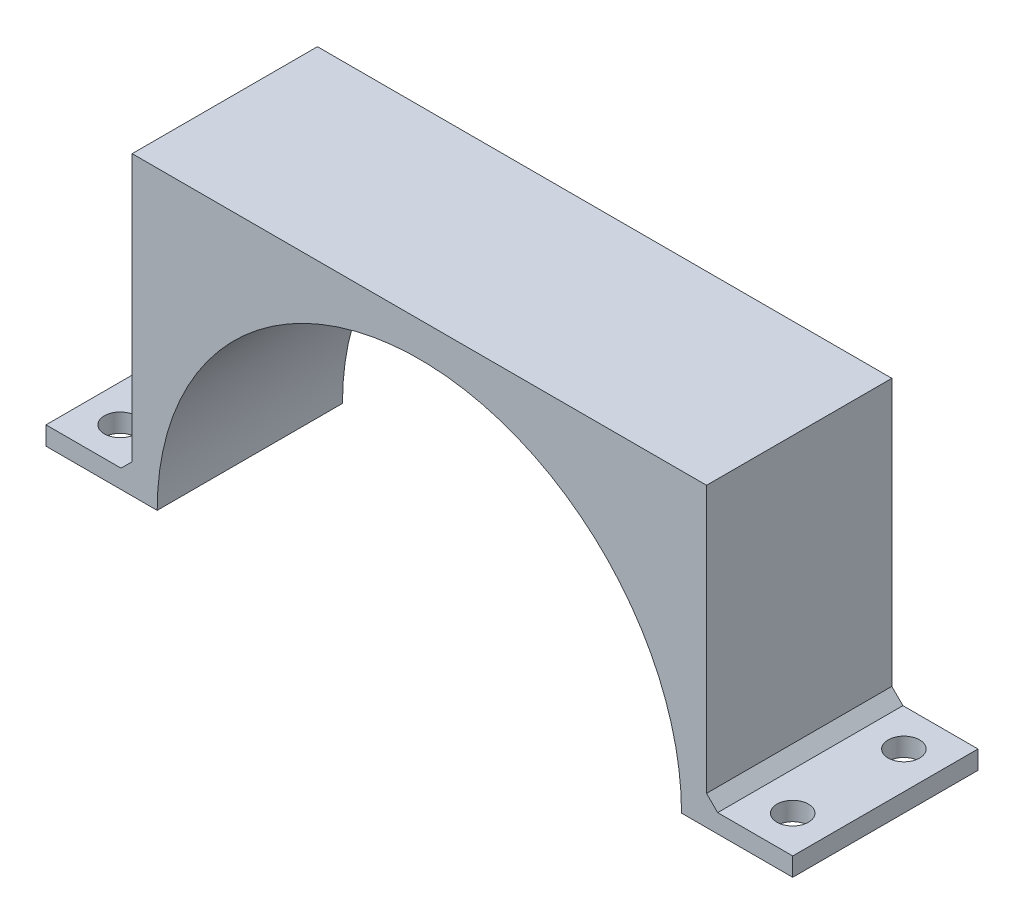
ISO-10303-21;
HEADER;
FILE_DESCRIPTION(('STEP AP214'),'2;1');
FILE_NAME('part.step','',(''),(''),'','','');
FILE_SCHEMA(('AUTOMOTIVE_DESIGN { 1 0 10303 214 1 1 1 1 }'));
ENDSEC;
DATA;
#1=APPLICATION_CONTEXT('core data for automotive mechanical design processes');
#2=APPLICATION_PROTOCOL_DEFINITION('international standard','automotive_design',2000,#1);
#3=PRODUCT_CONTEXT('',#1,'mechanical');
#4=PRODUCT('Part','Part','',(#3));
#5=PRODUCT_RELATED_PRODUCT_CATEGORY('part','',(#4));
#6=PRODUCT_DEFINITION_FORMATION('','',#4);
#7=PRODUCT_DEFINITION_CONTEXT('part definition',#1,'design');
#8=PRODUCT_DEFINITION('design','',#6,#7);
#9=PRODUCT_DEFINITION_SHAPE('','',#8);
#10=(LENGTH_UNIT() NAMED_UNIT(*) SI_UNIT(.MILLI.,.METRE.));
#11=(NAMED_UNIT(*) PLANE_ANGLE_UNIT() SI_UNIT($,.RADIAN.));
#12=(NAMED_UNIT(*) SI_UNIT($,.STERADIAN.) SOLID_ANGLE_UNIT());
#13=UNCERTAINTY_MEASURE_WITH_UNIT(LENGTH_MEASURE(1.E-05),#10,'distance_accuracy_value','');
#14=(GEOMETRIC_REPRESENTATION_CONTEXT(3) GLOBAL_UNCERTAINTY_ASSIGNED_CONTEXT((#13)) GLOBAL_UNIT_ASSIGNED_CONTEXT((#10,
#11,#12)) REPRESENTATION_CONTEXT('',''));
#15=CARTESIAN_POINT('',(0.,0.,0.));
#16=DIRECTION('',(0.,0.,1.));
#17=DIRECTION('',(1.,0.,0.));
#18=AXIS2_PLACEMENT_3D('',#15,#16,#17);
#19=CARTESIAN_POINT('',(-77.5,8.00000000000001,50.));
#20=DIRECTION('',(-0.707106781186548,0.707106781186547,0.));
#21=DIRECTION('',(0.,0.,-1.));
#22=AXIS2_PLACEMENT_3D('',#19,#20,#21);
#23=PLANE('',#22);
#24=DIRECTION('',(0.,0.,1.));
#25=VECTOR('',#24,1.);
#26=CARTESIAN_POINT('',(-77.5,8.00000000000001,0.));
#27=LINE('',#26,#25);
#28=CARTESIAN_POINT('',(-77.5,8.00000000000001,0.));
#29=VERTEX_POINT('',#28);
#30=CARTESIAN_POINT('',(-77.5,8.00000000000001,50.));
#31=VERTEX_POINT('',#30);
#32=EDGE_CURVE('E193',#29,#31,#27,.T.);
#33=ORIENTED_EDGE('',*,*,#32,.F.);
#34=DIRECTION('',(-0.707106781186547,-0.707106781186548,0.));
#35=VECTOR('',#34,1.);
#36=CARTESIAN_POINT('',(-77.5,8.00000000000001,0.));
#37=LINE('',#36,#35);
#38=CARTESIAN_POINT('',(-80.5,5.,0.));
#39=VERTEX_POINT('',#38);
#40=EDGE_CURVE('E58',#29,#39,#37,.T.);
#41=ORIENTED_EDGE('',*,*,#40,.T.);
#42=DIRECTION('',(0.,0.,-1.));
#43=VECTOR('',#42,1.);
#44=CARTESIAN_POINT('',(-80.5,5.,0.));
#45=LINE('',#44,#43);
#46=CARTESIAN_POINT('',(-80.5,5.,50.));
#47=VERTEX_POINT('',#46);
#48=EDGE_CURVE('E197',#47,#39,#45,.T.);
#49=ORIENTED_EDGE('',*,*,#48,.F.);
#50=DIRECTION('',(0.707106781186547,0.707106781186548,0.));
#51=VECTOR('',#50,1.);
#52=CARTESIAN_POINT('',(-42.75,42.75,50.));
#53=LINE('',#52,#51);
#54=EDGE_CURVE('E13',#47,#31,#53,.T.);
#55=ORIENTED_EDGE('',*,*,#54,.T.);
#56=EDGE_LOOP('',(#33,#41,#49,#55));
#57=FACE_BOUND('',#56,.T.);
#58=ADVANCED_FACE('F49',(#57),#23,.T.);
#59=CARTESIAN_POINT('',(77.5,8.,50.));
#60=DIRECTION('',(0.707106781186547,0.707106781186548,0.));
#61=DIRECTION('',(0.,0.,1.));
#62=AXIS2_PLACEMENT_3D('',#59,#60,#61);
#63=PLANE('',#62);
#64=DIRECTION('',(0.,0.,-1.));
#65=VECTOR('',#64,1.);
#66=CARTESIAN_POINT('',(77.5,8.,50.));
#67=LINE('',#66,#65);
#68=CARTESIAN_POINT('',(77.5,8.,50.));
#69=VERTEX_POINT('',#68);
#70=CARTESIAN_POINT('',(77.5,8.,0.));
#71=VERTEX_POINT('',#70);
#72=EDGE_CURVE('E163',#69,#71,#67,.T.);
#73=ORIENTED_EDGE('',*,*,#72,.F.);
#74=DIRECTION('',(0.707106781186548,-0.707106781186547,0.));
#75=VECTOR('',#74,1.);
#76=CARTESIAN_POINT('',(42.75,42.75,50.));
#77=LINE('',#76,#75);
#78=CARTESIAN_POINT('',(80.5,5.,50.));
#79=VERTEX_POINT('',#78);
#80=EDGE_CURVE('E187',#69,#79,#77,.T.);
#81=ORIENTED_EDGE('',*,*,#80,.T.);
#82=DIRECTION('',(0.,0.,1.));
#83=VECTOR('',#82,1.);
#84=CARTESIAN_POINT('',(80.5,5.,50.));
#85=LINE('',#84,#83);
#86=CARTESIAN_POINT('',(80.5,5.,0.));
#87=VERTEX_POINT('',#86);
#88=EDGE_CURVE('E168',#87,#79,#85,.T.);
#89=ORIENTED_EDGE('',*,*,#88,.F.);
#90=DIRECTION('',(-0.707106781186548,0.707106781186547,0.));
#91=VECTOR('',#90,1.);
#92=CARTESIAN_POINT('',(77.5,8.,0.));
#93=LINE('',#92,#91);
#94=EDGE_CURVE('E190',#87,#71,#93,.T.);
#95=ORIENTED_EDGE('',*,*,#94,.T.);
#96=EDGE_LOOP('',(#73,#81,#89,#95));
#97=FACE_BOUND('',#96,.T.);
#98=ADVANCED_FACE('F300',(#97),#63,.T.);
#99=CARTESIAN_POINT('',(0.,0.,50.));
#100=DIRECTION('',(0.,0.,-1.));
#101=DIRECTION('',(-1.,0.,0.));
#102=AXIS2_PLACEMENT_3D('',#99,#100,#101);
#103=CYLINDRICAL_SURFACE('',#102,70.75);
#104=CARTESIAN_POINT('',(0.,0.,0.));
#105=DIRECTION('',(0.,0.,-1.));
#106=DIRECTION('',(-1.,0.,0.));
#107=AXIS2_PLACEMENT_3D('',#104,#105,#106);
#108=CIRCLE('',#107,70.75);
#109=CARTESIAN_POINT('',(-70.75,0.,0.));
#110=VERTEX_POINT('',#109);
#111=CARTESIAN_POINT('',(70.75,0.,0.));
#112=VERTEX_POINT('',#111);
#113=EDGE_CURVE('E161',#110,#112,#108,.T.);
#114=ORIENTED_EDGE('',*,*,#113,.T.);
#115=DIRECTION('',(0.,0.,-1.));
#116=VECTOR('',#115,1.);
#117=CARTESIAN_POINT('',(70.75,0.,50.));
#118=LINE('',#117,#116);
#119=CARTESIAN_POINT('',(70.75,0.,50.));
#120=VERTEX_POINT('',#119);
#121=EDGE_CURVE('E140',#120,#112,#118,.T.);
#122=ORIENTED_EDGE('',*,*,#121,.F.);
#123=CARTESIAN_POINT('',(0.,0.,50.));
#124=DIRECTION('',(0.,0.,-1.));
#125=DIRECTION('',(-1.,0.,0.));
#126=AXIS2_PLACEMENT_3D('',#123,#124,#125);
#127=CIRCLE('',#126,70.75);
#128=CARTESIAN_POINT('',(-70.75,0.,50.));
#129=VERTEX_POINT('',#128);
#130=EDGE_CURVE('E147',#129,#120,#127,.T.);
#131=ORIENTED_EDGE('',*,*,#130,.F.);
#132=DIRECTION('',(0.,0.,-1.));
#133=VECTOR('',#132,1.);
#134=CARTESIAN_POINT('',(-70.75,0.,50.));
#135=LINE('',#134,#133);
#136=EDGE_CURVE('E219',#129,#110,#135,.T.);
#137=ORIENTED_EDGE('',*,*,#136,.T.);
#138=EDGE_LOOP('',(#114,#122,#131,#137));
#139=FACE_BOUND('',#138,.T.);
#140=ADVANCED_FACE('F159',(#139),#103,.F.);
#141=CARTESIAN_POINT('',(70.75,0.,50.));
#142=DIRECTION('',(0.,1.,0.));
#143=DIRECTION('',(0.,0.,1.));
#144=AXIS2_PLACEMENT_3D('',#141,#142,#143);
#145=PLANE('',#144);
#146=CARTESIAN_POINT('',(90.75,0.,10.));
#147=DIRECTION('',(0.,1.,0.));
#148=DIRECTION('',(0.,0.,1.));
#149=AXIS2_PLACEMENT_3D('',#146,#147,#148);
#150=CIRCLE('',#149,4.25000000000001);
#151=CARTESIAN_POINT('',(90.75,0.,14.25));
#152=VERTEX_POINT('',#151);
#153=EDGE_CURVE('E208',#152,#152,#150,.F.);
#154=ORIENTED_EDGE('',*,*,#153,.F.);
#155=EDGE_LOOP('',(#154));
#156=FACE_BOUND('',#155,.T.);
#157=CARTESIAN_POINT('',(90.75,0.,40.));
#158=DIRECTION('',(0.,1.,0.));
#159=DIRECTION('',(0.,0.,1.));
#160=AXIS2_PLACEMENT_3D('',#157,#158,#159);
#161=CIRCLE('',#160,4.25000000000001);
#162=CARTESIAN_POINT('',(90.75,0.,44.25));
#163=VERTEX_POINT('',#162);
#164=EDGE_CURVE('E204',#163,#163,#161,.F.);
#165=ORIENTED_EDGE('',*,*,#164,.F.);
#166=EDGE_LOOP('',(#165));
#167=FACE_BOUND('',#166,.T.);
#168=DIRECTION('',(1.,0.,0.));
#169=VECTOR('',#168,1.);
#170=CARTESIAN_POINT('',(70.75,0.,0.));
#171=LINE('',#170,#169);
#172=CARTESIAN_POINT('',(100.75,0.,0.));
#173=VERTEX_POINT('',#172);
#174=EDGE_CURVE('E261',#112,#173,#171,.T.);
#175=ORIENTED_EDGE('',*,*,#174,.T.);
#176=DIRECTION('',(0.,0.,-1.));
#177=VECTOR('',#176,1.);
#178=CARTESIAN_POINT('',(100.75,0.,50.));
#179=LINE('',#178,#177);
#180=CARTESIAN_POINT('',(100.75,0.,50.));
#181=VERTEX_POINT('',#180);
#182=EDGE_CURVE('E143',#181,#173,#179,.T.);
#183=ORIENTED_EDGE('',*,*,#182,.F.);
#184=DIRECTION('',(1.,0.,0.));
#185=VECTOR('',#184,1.);
#186=CARTESIAN_POINT('',(70.75,0.,50.));
#187=LINE('',#186,#185);
#188=EDGE_CURVE('E136',#120,#181,#187,.T.);
#189=ORIENTED_EDGE('',*,*,#188,.F.);
#190=ORIENTED_EDGE('',*,*,#121,.T.);
#191=EDGE_LOOP('',(#175,#183,#189,#190));
#192=FACE_BOUND('',#191,.T.);
#193=ADVANCED_FACE('F138',(#156,#167,#192),#145,.F.);
#194=CARTESIAN_POINT('',(100.75,0.,50.));
#195=DIRECTION('',(-1.,0.,0.));
#196=DIRECTION('',(0.,-1.,0.));
#197=AXIS2_PLACEMENT_3D('',#194,#195,#196);
#198=PLANE('',#197);
#199=DIRECTION('',(0.,1.,0.));
#200=VECTOR('',#199,1.);
#201=CARTESIAN_POINT('',(100.75,0.,0.));
#202=LINE('',#201,#200);
#203=CARTESIAN_POINT('',(100.75,5.,0.));
#204=VERTEX_POINT('',#203);
#205=EDGE_CURVE('E264',#173,#204,#202,.T.);
#206=ORIENTED_EDGE('',*,*,#205,.T.);
#207=DIRECTION('',(0.,0.,-1.));
#208=VECTOR('',#207,1.);
#209=CARTESIAN_POINT('',(100.75,5.,50.));
#210=LINE('',#209,#208);
#211=CARTESIAN_POINT('',(100.75,5.,50.));
#212=VERTEX_POINT('',#211);
#213=EDGE_CURVE('E171',#212,#204,#210,.T.);
#214=ORIENTED_EDGE('',*,*,#213,.F.);
#215=DIRECTION('',(0.,1.,0.));
#216=VECTOR('',#215,1.);
#217=CARTESIAN_POINT('',(100.75,0.,50.));
#218=LINE('',#217,#216);
#219=EDGE_CURVE('E146',#181,#212,#218,.T.);
#220=ORIENTED_EDGE('',*,*,#219,.F.);
#221=ORIENTED_EDGE('',*,*,#182,.T.);
#222=EDGE_LOOP('',(#206,#214,#220,#221));
#223=FACE_BOUND('',#222,.T.);
#224=ADVANCED_FACE('F321',(#223),#198,.F.);
#225=CARTESIAN_POINT('',(100.75,5.,50.));
#226=DIRECTION('',(0.,-1.,0.));
#227=DIRECTION('',(1.,0.,0.));
#228=AXIS2_PLACEMENT_3D('',#225,#226,#227);
#229=PLANE('',#228);
#230=CARTESIAN_POINT('',(90.75,5.00000000000001,10.));
#231=DIRECTION('',(0.,-1.,0.));
#232=DIRECTION('',(1.,0.,0.));
#233=AXIS2_PLACEMENT_3D('',#230,#231,#232);
#234=CIRCLE('',#233,4.25000000000001);
#235=CARTESIAN_POINT('',(95.,5.,10.));
#236=VERTEX_POINT('',#235);
#237=EDGE_CURVE('E201',#236,#236,#234,.T.);
#238=ORIENTED_EDGE('',*,*,#237,.T.);
#239=EDGE_LOOP('',(#238));
#240=FACE_BOUND('',#239,.T.);
#241=CARTESIAN_POINT('',(90.75,5.00000000000001,40.));
#242=DIRECTION('',(0.,-1.,0.));
#243=DIRECTION('',(1.,0.,0.));
#244=AXIS2_PLACEMENT_3D('',#241,#242,#243);
#245=CIRCLE('',#244,4.25000000000001);
#246=CARTESIAN_POINT('',(95.,5.,40.));
#247=VERTEX_POINT('',#246);
#248=EDGE_CURVE('E205',#247,#247,#245,.T.);
#249=ORIENTED_EDGE('',*,*,#248,.T.);
#250=EDGE_LOOP('',(#249));
#251=FACE_BOUND('',#250,.T.);
#252=DIRECTION('',(-1.,0.,0.));
#253=VECTOR('',#252,1.);
#254=CARTESIAN_POINT('',(100.75,5.,0.));
#255=LINE('',#254,#253);
#256=EDGE_CURVE('E269',#204,#87,#255,.T.);
#257=ORIENTED_EDGE('',*,*,#256,.T.);
#258=ORIENTED_EDGE('',*,*,#88,.T.);
#259=DIRECTION('',(-1.,0.,0.));
#260=VECTOR('',#259,1.);
#261=CARTESIAN_POINT('',(100.75,5.,50.));
#262=LINE('',#261,#260);
#263=EDGE_CURVE('E237',#212,#79,#262,.T.);
#264=ORIENTED_EDGE('',*,*,#263,.F.);
#265=ORIENTED_EDGE('',*,*,#213,.T.);
#266=EDGE_LOOP('',(#257,#258,#264,#265));
#267=FACE_BOUND('',#266,.T.);
#268=ADVANCED_FACE('F289',(#240,#251,#267),#229,.F.);
#269=CARTESIAN_POINT('',(77.5,5.,50.));
#270=DIRECTION('',(-1.,0.,0.));
#271=DIRECTION('',(0.,0.,1.));
#272=AXIS2_PLACEMENT_3D('',#269,#270,#271);
#273=PLANE('',#272);
#274=DIRECTION('',(0.,1.,0.));
#275=VECTOR('',#274,1.);
#276=CARTESIAN_POINT('',(77.5,5.,50.));
#277=LINE('',#276,#275);
#278=CARTESIAN_POINT('',(77.5,80.,50.));
#279=VERTEX_POINT('',#278);
#280=EDGE_CURVE('E235',#69,#279,#277,.T.);
#281=ORIENTED_EDGE('',*,*,#280,.F.);
#282=ORIENTED_EDGE('',*,*,#72,.T.);
#283=DIRECTION('',(0.,1.,0.));
#284=VECTOR('',#283,1.);
#285=CARTESIAN_POINT('',(77.5,5.,0.));
#286=LINE('',#285,#284);
#287=CARTESIAN_POINT('',(77.5,80.,0.));
#288=VERTEX_POINT('',#287);
#289=EDGE_CURVE('E273',#71,#288,#286,.T.);
#290=ORIENTED_EDGE('',*,*,#289,.T.);
#291=DIRECTION('',(0.,0.,-1.));
#292=VECTOR('',#291,1.);
#293=CARTESIAN_POINT('',(77.5,80.,50.));
#294=LINE('',#293,#292);
#295=EDGE_CURVE('E233',#279,#288,#294,.T.);
#296=ORIENTED_EDGE('',*,*,#295,.F.);
#297=EDGE_LOOP('',(#281,#282,#290,#296));
#298=FACE_BOUND('',#297,.T.);
#299=ADVANCED_FACE('F328',(#298),#273,.F.);
#300=CARTESIAN_POINT('',(77.5,80.,50.));
#301=DIRECTION('',(0.,-1.,0.));
#302=DIRECTION('',(0.,0.,-1.));
#303=AXIS2_PLACEMENT_3D('',#300,#301,#302);
#304=PLANE('',#303);
#305=DIRECTION('',(-1.,0.,0.));
#306=VECTOR('',#305,1.);
#307=CARTESIAN_POINT('',(77.5,80.,0.));
#308=LINE('',#307,#306);
#309=CARTESIAN_POINT('',(-77.5,80.,0.));
#310=VERTEX_POINT('',#309);
#311=EDGE_CURVE('E227',#288,#310,#308,.T.);
#312=ORIENTED_EDGE('',*,*,#311,.T.);
#313=DIRECTION('',(0.,0.,-1.));
#314=VECTOR('',#313,1.);
#315=CARTESIAN_POINT('',(-77.5,80.,50.));
#316=LINE('',#315,#314);
#317=CARTESIAN_POINT('',(-77.5,80.,50.));
#318=VERTEX_POINT('',#317);
#319=EDGE_CURVE('E230',#318,#310,#316,.T.);
#320=ORIENTED_EDGE('',*,*,#319,.F.);
#321=DIRECTION('',(-1.,0.,0.));
#322=VECTOR('',#321,1.);
#323=CARTESIAN_POINT('',(77.5,80.,50.));
#324=LINE('',#323,#322);
#325=EDGE_CURVE('E236',#279,#318,#324,.T.);
#326=ORIENTED_EDGE('',*,*,#325,.F.);
#327=ORIENTED_EDGE('',*,*,#295,.T.);
#328=EDGE_LOOP('',(#312,#320,#326,#327));
#329=FACE_BOUND('',#328,.T.);
#330=ADVANCED_FACE('F343',(#329),#304,.F.);
#331=CARTESIAN_POINT('',(-77.5,80.,50.));
#332=DIRECTION('',(1.,0.,0.));
#333=DIRECTION('',(0.,0.,-1.));
#334=AXIS2_PLACEMENT_3D('',#331,#332,#333);
#335=PLANE('',#334);
#336=DIRECTION('',(0.,-1.,0.));
#337=VECTOR('',#336,1.);
#338=CARTESIAN_POINT('',(-77.5,80.,0.));
#339=LINE('',#338,#337);
#340=EDGE_CURVE('E224',#310,#29,#339,.T.);
#341=ORIENTED_EDGE('',*,*,#340,.T.);
#342=ORIENTED_EDGE('',*,*,#32,.T.);
#343=DIRECTION('',(0.,-1.,0.));
#344=VECTOR('',#343,1.);
#345=CARTESIAN_POINT('',(-77.5,80.,50.));
#346=LINE('',#345,#344);
#347=EDGE_CURVE('E248',#318,#31,#346,.T.);
#348=ORIENTED_EDGE('',*,*,#347,.F.);
#349=ORIENTED_EDGE('',*,*,#319,.T.);
#350=EDGE_LOOP('',(#341,#342,#348,#349));
#351=FACE_BOUND('',#350,.T.);
#352=ADVANCED_FACE('F340',(#351),#335,.F.);
#353=CARTESIAN_POINT('',(-77.5,5.,50.));
#354=DIRECTION('',(0.,-1.,0.));
#355=DIRECTION('',(1.,0.,0.));
#356=AXIS2_PLACEMENT_3D('',#353,#354,#355);
#357=PLANE('',#356);
#358=CARTESIAN_POINT('',(-90.75,5.00000000000001,10.));
#359=DIRECTION('',(0.,1.,0.));
#360=DIRECTION('',(-1.,0.,0.));
#361=AXIS2_PLACEMENT_3D('',#358,#359,#360);
#362=CIRCLE('',#361,4.25000000000001);
#363=CARTESIAN_POINT('',(-95.,5.,10.));
#364=VERTEX_POINT('',#363);
#365=EDGE_CURVE('E180',#364,#364,#362,.T.);
#366=ORIENTED_EDGE('',*,*,#365,.F.);
#367=EDGE_LOOP('',(#366));
#368=FACE_BOUND('',#367,.T.);
#369=CARTESIAN_POINT('',(-90.75,5.00000000000001,40.));
#370=DIRECTION('',(0.,1.,0.));
#371=DIRECTION('',(-1.,0.,0.));
#372=AXIS2_PLACEMENT_3D('',#369,#370,#371);
#373=CIRCLE('',#372,4.25000000000001);
#374=CARTESIAN_POINT('',(-95.,5.,40.));
#375=VERTEX_POINT('',#374);
#376=EDGE_CURVE('E243',#375,#375,#373,.T.);
#377=ORIENTED_EDGE('',*,*,#376,.F.);
#378=EDGE_LOOP('',(#377));
#379=FACE_BOUND('',#378,.T.);
#380=DIRECTION('',(-1.,0.,0.));
#381=VECTOR('',#380,1.);
#382=CARTESIAN_POINT('',(-77.5,5.,50.));
#383=LINE('',#382,#381);
#384=CARTESIAN_POINT('',(-100.75,5.,50.));
#385=VERTEX_POINT('',#384);
#386=EDGE_CURVE('E212',#47,#385,#383,.T.);
#387=ORIENTED_EDGE('',*,*,#386,.F.);
#388=ORIENTED_EDGE('',*,*,#48,.T.);
#389=DIRECTION('',(-1.,0.,0.));
#390=VECTOR('',#389,1.);
#391=CARTESIAN_POINT('',(-77.5,5.,0.));
#392=LINE('',#391,#390);
#393=CARTESIAN_POINT('',(-100.75,5.,0.));
#394=VERTEX_POINT('',#393);
#395=EDGE_CURVE('E221',#39,#394,#392,.T.);
#396=ORIENTED_EDGE('',*,*,#395,.T.);
#397=DIRECTION('',(0.,0.,-1.));
#398=VECTOR('',#397,1.);
#399=CARTESIAN_POINT('',(-100.75,5.,50.));
#400=LINE('',#399,#398);
#401=EDGE_CURVE('E218',#385,#394,#400,.T.);
#402=ORIENTED_EDGE('',*,*,#401,.F.);
#403=EDGE_LOOP('',(#387,#388,#396,#402));
#404=FACE_BOUND('',#403,.T.);
#405=ADVANCED_FACE('F313',(#368,#379,#404),#357,.F.);
#406=CARTESIAN_POINT('',(-100.75,5.,50.));
#407=DIRECTION('',(1.,0.,0.));
#408=DIRECTION('',(0.,0.,-1.));
#409=AXIS2_PLACEMENT_3D('',#406,#407,#408);
#410=PLANE('',#409);
#411=DIRECTION('',(0.,-1.,0.));
#412=VECTOR('',#411,1.);
#413=CARTESIAN_POINT('',(-100.75,5.,0.));
#414=LINE('',#413,#412);
#415=CARTESIAN_POINT('',(-100.75,0.,0.));
#416=VERTEX_POINT('',#415);
#417=EDGE_CURVE('E223',#394,#416,#414,.T.);
#418=ORIENTED_EDGE('',*,*,#417,.T.);
#419=DIRECTION('',(0.,0.,-1.));
#420=VECTOR('',#419,1.);
#421=CARTESIAN_POINT('',(-100.75,0.,50.));
#422=LINE('',#421,#420);
#423=CARTESIAN_POINT('',(-100.75,0.,50.));
#424=VERTEX_POINT('',#423);
#425=EDGE_CURVE('E215',#424,#416,#422,.T.);
#426=ORIENTED_EDGE('',*,*,#425,.F.);
#427=DIRECTION('',(0.,-1.,0.));
#428=VECTOR('',#427,1.);
#429=CARTESIAN_POINT('',(-100.75,5.,50.));
#430=LINE('',#429,#428);
#431=EDGE_CURVE('E211',#385,#424,#430,.T.);
#432=ORIENTED_EDGE('',*,*,#431,.F.);
#433=ORIENTED_EDGE('',*,*,#401,.T.);
#434=EDGE_LOOP('',(#418,#426,#432,#433));
#435=FACE_BOUND('',#434,.T.);
#436=ADVANCED_FACE('F317',(#435),#410,.F.);
#437=CARTESIAN_POINT('',(-100.75,0.,50.));
#438=DIRECTION('',(0.,1.,0.));
#439=DIRECTION('',(0.,0.,1.));
#440=AXIS2_PLACEMENT_3D('',#437,#438,#439);
#441=PLANE('',#440);
#442=CARTESIAN_POINT('',(-90.75,0.,10.));
#443=DIRECTION('',(0.,1.,0.));
#444=DIRECTION('',(0.,0.,1.));
#445=AXIS2_PLACEMENT_3D('',#442,#443,#444);
#446=CIRCLE('',#445,4.25000000000001);
#447=CARTESIAN_POINT('',(-90.75,0.,14.25));
#448=VERTEX_POINT('',#447);
#449=EDGE_CURVE('E179',#448,#448,#446,.T.);
#450=ORIENTED_EDGE('',*,*,#449,.T.);
#451=EDGE_LOOP('',(#450));
#452=FACE_BOUND('',#451,.T.);
#453=CARTESIAN_POINT('',(-90.75,0.,40.));
#454=DIRECTION('',(0.,1.,0.));
#455=DIRECTION('',(0.,0.,1.));
#456=AXIS2_PLACEMENT_3D('',#453,#454,#455);
#457=CIRCLE('',#456,4.25000000000001);
#458=CARTESIAN_POINT('',(-90.75,0.,44.25));
#459=VERTEX_POINT('',#458);
#460=EDGE_CURVE('E175',#459,#459,#457,.T.);
#461=ORIENTED_EDGE('',*,*,#460,.T.);
#462=EDGE_LOOP('',(#461));
#463=FACE_BOUND('',#462,.T.);
#464=DIRECTION('',(1.,0.,0.));
#465=VECTOR('',#464,1.);
#466=CARTESIAN_POINT('',(-100.75,0.,0.));
#467=LINE('',#466,#465);
#468=EDGE_CURVE('E157',#416,#110,#467,.T.);
#469=ORIENTED_EDGE('',*,*,#468,.T.);
#470=ORIENTED_EDGE('',*,*,#136,.F.);
#471=DIRECTION('',(1.,0.,0.));
#472=VECTOR('',#471,1.);
#473=CARTESIAN_POINT('',(-100.75,0.,50.));
#474=LINE('',#473,#472);
#475=EDGE_CURVE('E152',#424,#129,#474,.T.);
#476=ORIENTED_EDGE('',*,*,#475,.F.);
#477=ORIENTED_EDGE('',*,*,#425,.T.);
#478=EDGE_LOOP('',(#469,#470,#476,#477));
#479=FACE_BOUND('',#478,.T.);
#480=ADVANCED_FACE('F320',(#452,#463,#479),#441,.F.);
#481=CARTESIAN_POINT('',(0.,0.,50.));
#482=DIRECTION('',(0.,0.,-1.));
#483=DIRECTION('',(-1.,0.,0.));
#484=AXIS2_PLACEMENT_3D('',#481,#482,#483);
#485=PLANE('',#484);
#486=ORIENTED_EDGE('',*,*,#54,.F.);
#487=ORIENTED_EDGE('',*,*,#386,.T.);
#488=ORIENTED_EDGE('',*,*,#431,.T.);
#489=ORIENTED_EDGE('',*,*,#475,.T.);
#490=ORIENTED_EDGE('',*,*,#130,.T.);
#491=ORIENTED_EDGE('',*,*,#188,.T.);
#492=ORIENTED_EDGE('',*,*,#219,.T.);
#493=ORIENTED_EDGE('',*,*,#263,.T.);
#494=ORIENTED_EDGE('',*,*,#80,.F.);
#495=ORIENTED_EDGE('',*,*,#280,.T.);
#496=ORIENTED_EDGE('',*,*,#325,.T.);
#497=ORIENTED_EDGE('',*,*,#347,.T.);
#498=EDGE_LOOP('',(#486,#487,#488,#489,#490,#491,#492,#493,#494,#495,#496,#497));
#499=FACE_BOUND('',#498,.T.);
#500=ADVANCED_FACE('F150',(#499),#485,.F.);
#501=CARTESIAN_POINT('',(0.,0.,0.));
#502=DIRECTION('',(0.,0.,-1.));
#503=DIRECTION('',(-1.,0.,0.));
#504=AXIS2_PLACEMENT_3D('',#501,#502,#503);
#505=PLANE('',#504);
#506=ORIENTED_EDGE('',*,*,#113,.F.);
#507=ORIENTED_EDGE('',*,*,#468,.F.);
#508=ORIENTED_EDGE('',*,*,#417,.F.);
#509=ORIENTED_EDGE('',*,*,#395,.F.);
#510=ORIENTED_EDGE('',*,*,#40,.F.);
#511=ORIENTED_EDGE('',*,*,#340,.F.);
#512=ORIENTED_EDGE('',*,*,#311,.F.);
#513=ORIENTED_EDGE('',*,*,#289,.F.);
#514=ORIENTED_EDGE('',*,*,#94,.F.);
#515=ORIENTED_EDGE('',*,*,#256,.F.);
#516=ORIENTED_EDGE('',*,*,#205,.F.);
#517=ORIENTED_EDGE('',*,*,#174,.F.);
#518=EDGE_LOOP('',(#506,#507,#508,#509,#510,#511,#512,#513,#514,#515,#516,#517));
#519=FACE_BOUND('',#518,.T.);
#520=ADVANCED_FACE('F294',(#519),#505,.T.);
#521=CARTESIAN_POINT('',(-90.75,-45.,40.));
#522=DIRECTION('',(0.,1.,0.));
#523=DIRECTION('',(-1.,0.,0.));
#524=AXIS2_PLACEMENT_3D('',#521,#522,#523);
#525=CYLINDRICAL_SURFACE('',#524,4.25000000000001);
#526=ORIENTED_EDGE('',*,*,#376,.T.);
#527=EDGE_LOOP('',(#526));
#528=FACE_BOUND('',#527,.T.);
#529=ORIENTED_EDGE('',*,*,#460,.F.);
#530=EDGE_LOOP('',(#529));
#531=FACE_BOUND('',#530,.T.);
#532=ADVANCED_FACE('F367',(#528,#531),#525,.F.);
#533=CARTESIAN_POINT('',(-90.75,-45.,10.));
#534=DIRECTION('',(0.,1.,0.));
#535=DIRECTION('',(-1.,0.,0.));
#536=AXIS2_PLACEMENT_3D('',#533,#534,#535);
#537=CYLINDRICAL_SURFACE('',#536,4.25000000000001);
#538=ORIENTED_EDGE('',*,*,#365,.T.);
#539=EDGE_LOOP('',(#538));
#540=FACE_BOUND('',#539,.T.);
#541=ORIENTED_EDGE('',*,*,#449,.F.);
#542=EDGE_LOOP('',(#541));
#543=FACE_BOUND('',#542,.T.);
#544=ADVANCED_FACE('F372',(#540,#543),#537,.F.);
#545=CARTESIAN_POINT('',(90.75,-45.,40.));
#546=DIRECTION('',(0.,1.,0.));
#547=DIRECTION('',(-1.,0.,0.));
#548=AXIS2_PLACEMENT_3D('',#545,#546,#547);
#549=CYLINDRICAL_SURFACE('',#548,4.25000000000001);
#550=ORIENTED_EDGE('',*,*,#248,.F.);
#551=EDGE_LOOP('',(#550));
#552=FACE_BOUND('',#551,.T.);
#553=ORIENTED_EDGE('',*,*,#164,.T.);
#554=EDGE_LOOP('',(#553));
#555=FACE_BOUND('',#554,.T.);
#556=ADVANCED_FACE('F376',(#552,#555),#549,.F.);
#557=CARTESIAN_POINT('',(90.75,-45.,10.));
#558=DIRECTION('',(0.,1.,0.));
#559=DIRECTION('',(-1.,0.,0.));
#560=AXIS2_PLACEMENT_3D('',#557,#558,#559);
#561=CYLINDRICAL_SURFACE('',#560,4.25000000000001);
#562=ORIENTED_EDGE('',*,*,#237,.F.);
#563=EDGE_LOOP('',(#562));
#564=FACE_BOUND('',#563,.T.);
#565=ORIENTED_EDGE('',*,*,#153,.T.);
#566=EDGE_LOOP('',(#565));
#567=FACE_BOUND('',#566,.T.);
#568=ADVANCED_FACE('F380',(#564,#567),#561,.F.);
#569=CLOSED_SHELL('',(#58,#98,#140,#193,#224,#268,#299,#330,#352,#405,#436,#480,#500,#520,#532,
#544,#556,#568));
#570=MANIFOLD_SOLID_BREP('B2',#569);
#571=ADVANCED_BREP_SHAPE_REPRESENTATION('',(#18,#570),#14);
#572=SHAPE_DEFINITION_REPRESENTATION(#9,#571);
ENDSEC;
END-ISO-10303-21;
